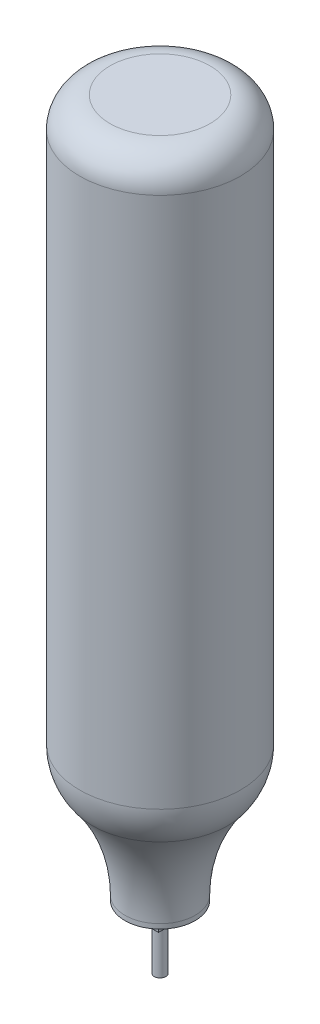
ISO-10303-21;
HEADER;
FILE_DESCRIPTION(('STEP AP214'),'2;1');
FILE_NAME('part.step','',(''),(''),'','','');
FILE_SCHEMA(('AUTOMOTIVE_DESIGN { 1 0 10303 214 1 1 1 1 }'));
ENDSEC;
DATA;
#1=APPLICATION_CONTEXT('core data for automotive mechanical design processes');
#2=APPLICATION_PROTOCOL_DEFINITION('international standard','automotive_design',2000,#1);
#3=PRODUCT_CONTEXT('',#1,'mechanical');
#4=PRODUCT('Part','Part','',(#3));
#5=PRODUCT_RELATED_PRODUCT_CATEGORY('part','',(#4));
#6=PRODUCT_DEFINITION_FORMATION('','',#4);
#7=PRODUCT_DEFINITION_CONTEXT('part definition',#1,'design');
#8=PRODUCT_DEFINITION('design','',#6,#7);
#9=PRODUCT_DEFINITION_SHAPE('','',#8);
#10=(LENGTH_UNIT() NAMED_UNIT(*) SI_UNIT(.MILLI.,.METRE.));
#11=(NAMED_UNIT(*) PLANE_ANGLE_UNIT() SI_UNIT($,.RADIAN.));
#12=(NAMED_UNIT(*) SI_UNIT($,.STERADIAN.) SOLID_ANGLE_UNIT());
#13=UNCERTAINTY_MEASURE_WITH_UNIT(LENGTH_MEASURE(1.E-05),#10,'distance_accuracy_value','');
#14=(GEOMETRIC_REPRESENTATION_CONTEXT(3) GLOBAL_UNCERTAINTY_ASSIGNED_CONTEXT((#13)) GLOBAL_UNIT_ASSIGNED_CONTEXT((#10,
#11,#12)) REPRESENTATION_CONTEXT('',''));
#15=CARTESIAN_POINT('',(0.,0.,0.));
#16=DIRECTION('',(0.,0.,1.));
#17=DIRECTION('',(1.,0.,0.));
#18=AXIS2_PLACEMENT_3D('',#15,#16,#17);
#19=CARTESIAN_POINT('',(0.,0.,0.));
#20=DIRECTION('',(0.,1.,0.));
#21=DIRECTION('',(0.,0.,1.));
#22=AXIS2_PLACEMENT_3D('',#19,#20,#21);
#23=PLANE('',#22);
#24=CARTESIAN_POINT('',(0.,0.,0.));
#25=DIRECTION('',(0.,-1.,0.));
#26=DIRECTION('',(0.,0.,-1.));
#27=AXIS2_PLACEMENT_3D('',#24,#25,#26);
#28=CIRCLE('',#27,11.5644162933336);
#29=CARTESIAN_POINT('',(0.,0.,-11.5644162933336));
#30=VERTEX_POINT('',#29);
#31=EDGE_CURVE('E109',#30,#30,#28,.T.);
#32=ORIENTED_EDGE('',*,*,#31,.T.);
#33=EDGE_LOOP('',(#32));
#34=FACE_BOUND('',#33,.T.);
#35=DIRECTION('',(0.,0.,-1.));
#36=VECTOR('',#35,1.);
#37=CARTESIAN_POINT('',(-3.47376504276298,0.,-3.99491974947905));
#38=LINE('',#37,#36);
#39=CARTESIAN_POINT('',(-3.47376504276298,0.,3.99491974947905));
#40=VERTEX_POINT('',#39);
#41=CARTESIAN_POINT('',(-3.47376504276298,0.,-3.99491974947905));
#42=VERTEX_POINT('',#41);
#43=EDGE_CURVE('E60',#40,#42,#38,.T.);
#44=ORIENTED_EDGE('',*,*,#43,.F.);
#45=DIRECTION('',(-1.,0.,0.));
#46=VECTOR('',#45,1.);
#47=CARTESIAN_POINT('',(3.47376504276298,0.,3.99491974947905));
#48=LINE('',#47,#46);
#49=CARTESIAN_POINT('',(3.47376504276298,0.,3.99491974947905));
#50=VERTEX_POINT('',#49);
#51=EDGE_CURVE('E64',#50,#40,#48,.T.);
#52=ORIENTED_EDGE('',*,*,#51,.F.);
#53=DIRECTION('',(0.,0.,1.));
#54=VECTOR('',#53,1.);
#55=CARTESIAN_POINT('',(3.47376504276298,0.,-3.99491974947905));
#56=LINE('',#55,#54);
#57=CARTESIAN_POINT('',(3.47376504276298,0.,-3.99491974947905));
#58=VERTEX_POINT('',#57);
#59=EDGE_CURVE('E219',#58,#50,#56,.T.);
#60=ORIENTED_EDGE('',*,*,#59,.F.);
#61=DIRECTION('',(1.,0.,0.));
#62=VECTOR('',#61,1.);
#63=CARTESIAN_POINT('',(3.47376504276298,0.,-3.99491974947905));
#64=LINE('',#63,#62);
#65=EDGE_CURVE('E209',#42,#58,#64,.T.);
#66=ORIENTED_EDGE('',*,*,#65,.F.);
#67=EDGE_LOOP('',(#44,#52,#60,#66));
#68=FACE_BOUND('',#67,.T.);
#69=ADVANCED_FACE('F43',(#34,#68),#23,.F.);
#70=CARTESIAN_POINT('',(0.,230.,0.));
#71=DIRECTION('',(0.,-1.,0.));
#72=DIRECTION('',(0.,0.,-1.));
#73=AXIS2_PLACEMENT_3D('',#70,#71,#72);
#74=CYLINDRICAL_SURFACE('',#73,26.5);
#75=CARTESIAN_POINT('',(0.,220.,0.));
#76=DIRECTION('',(0.,1.,0.));
#77=DIRECTION('',(0.,0.,1.));
#78=AXIS2_PLACEMENT_3D('',#75,#76,#77);
#79=CIRCLE('',#78,26.5);
#80=CARTESIAN_POINT('',(0.,220.,26.5));
#81=VERTEX_POINT('',#80);
#82=EDGE_CURVE('E47',#81,#81,#79,.F.);
#83=ORIENTED_EDGE('',*,*,#82,.T.);
#84=EDGE_LOOP('',(#83));
#85=FACE_BOUND('',#84,.T.);
#86=CARTESIAN_POINT('',(0.,44.7481701359022,0.));
#87=DIRECTION('',(0.,-1.,0.));
#88=DIRECTION('',(0.,0.,-1.));
#89=AXIS2_PLACEMENT_3D('',#86,#87,#88);
#90=CIRCLE('',#89,26.5);
#91=CARTESIAN_POINT('',(0.,44.7481701359022,-26.5));
#92=VERTEX_POINT('',#91);
#93=EDGE_CURVE('E114',#92,#92,#90,.F.);
#94=ORIENTED_EDGE('',*,*,#93,.T.);
#95=EDGE_LOOP('',(#94));
#96=FACE_BOUND('',#95,.T.);
#97=ADVANCED_FACE('F139',(#85,#96),#74,.T.);
#98=CARTESIAN_POINT('',(0.,230.,0.));
#99=DIRECTION('',(0.,1.,0.));
#100=DIRECTION('',(0.,0.,1.));
#101=AXIS2_PLACEMENT_3D('',#98,#99,#100);
#102=PLANE('',#101);
#103=CARTESIAN_POINT('',(0.,230.,0.));
#104=DIRECTION('',(0.,1.,0.));
#105=DIRECTION('',(0.,0.,1.));
#106=AXIS2_PLACEMENT_3D('',#103,#104,#105);
#107=CIRCLE('',#106,16.5);
#108=CARTESIAN_POINT('',(0.,230.,16.5));
#109=VERTEX_POINT('',#108);
#110=EDGE_CURVE('E130',#109,#109,#107,.T.);
#111=ORIENTED_EDGE('',*,*,#110,.T.);
#112=EDGE_LOOP('',(#111));
#113=FACE_BOUND('',#112,.T.);
#114=ADVANCED_FACE('F158',(#113),#102,.T.);
#115=CARTESIAN_POINT('',(0.,25.4,0.));
#116=DIRECTION('',(0.,-1.,0.));
#117=DIRECTION('',(0.,0.,-1.));
#118=AXIS2_PLACEMENT_3D('',#115,#116,#117);
#119=CYLINDRICAL_SURFACE('',#118,11.5644162933336);
#120=CARTESIAN_POINT('',(0.,1.52884508015357,0.));
#121=DIRECTION('',(0.,-1.,0.));
#122=DIRECTION('',(0.,0.,-1.));
#123=AXIS2_PLACEMENT_3D('',#120,#121,#122);
#124=CIRCLE('',#123,11.5644162933336);
#125=CARTESIAN_POINT('',(0.,1.52884508015357,-11.5644162933336));
#126=VERTEX_POINT('',#125);
#127=EDGE_CURVE('E123',#126,#126,#124,.T.);
#128=ORIENTED_EDGE('',*,*,#127,.T.);
#129=EDGE_LOOP('',(#128));
#130=FACE_BOUND('',#129,.T.);
#131=ORIENTED_EDGE('',*,*,#31,.F.);
#132=EDGE_LOOP('',(#131));
#133=FACE_BOUND('',#132,.T.);
#134=ADVANCED_FACE('F164',(#130,#133),#119,.T.);
#135=CARTESIAN_POINT('',(0.,44.7481701359022,0.));
#136=DIRECTION('',(0.,-1.,0.));
#137=DIRECTION('',(0.,0.,-1.));
#138=AXIS2_PLACEMENT_3D('',#135,#136,#137);
#139=DEGENERATE_TOROIDAL_SURFACE('',#138,6.5,20.,.T.);
#140=CARTESIAN_POINT('',(0.,32.3997915485454,0.));
#141=DIRECTION('',(0.,1.,0.));
#142=DIRECTION('',(0.,0.,1.));
#143=AXIS2_PLACEMENT_3D('',#140,#141,#142);
#144=CIRCLE('',#143,22.2326903695239);
#145=CARTESIAN_POINT('',(0.,32.3997915485454,22.2326903695239));
#146=VERTEX_POINT('',#145);
#147=EDGE_CURVE('E127',#146,#146,#144,.T.);
#148=ORIENTED_EDGE('',*,*,#147,.T.);
#149=EDGE_LOOP('',(#148));
#150=FACE_BOUND('',#149,.T.);
#151=ORIENTED_EDGE('',*,*,#93,.F.);
#152=EDGE_LOOP('',(#151));
#153=FACE_BOUND('',#152,.T.);
#154=ADVANCED_FACE('F150',(#150,#153),#139,.T.);
#155=CARTESIAN_POINT('',(0.,1.52884508015357,0.));
#156=DIRECTION('',(0.,-1.,0.));
#157=DIRECTION('',(0.,0.,-1.));
#158=AXIS2_PLACEMENT_3D('',#155,#156,#157);
#159=TOROIDAL_SURFACE('',#158,61.5644162933336,50.);
#160=ORIENTED_EDGE('',*,*,#147,.F.);
#161=EDGE_LOOP('',(#160));
#162=FACE_BOUND('',#161,.T.);
#163=ORIENTED_EDGE('',*,*,#127,.F.);
#164=EDGE_LOOP('',(#163));
#165=FACE_BOUND('',#164,.T.);
#166=ADVANCED_FACE('F144',(#162,#165),#159,.F.);
#167=CARTESIAN_POINT('',(0.,220.,0.));
#168=DIRECTION('',(0.,1.,0.));
#169=DIRECTION('',(0.,0.,1.));
#170=AXIS2_PLACEMENT_3D('',#167,#168,#169);
#171=TOROIDAL_SURFACE('',#170,16.5,10.);
#172=ORIENTED_EDGE('',*,*,#82,.F.);
#173=EDGE_LOOP('',(#172));
#174=FACE_BOUND('',#173,.T.);
#175=ORIENTED_EDGE('',*,*,#110,.F.);
#176=EDGE_LOOP('',(#175));
#177=FACE_BOUND('',#176,.T.);
#178=ADVANCED_FACE('F45',(#174,#177),#171,.T.);
#179=CARTESIAN_POINT('',(-3.47376504276298,-5.4,-3.99491974947905));
#180=DIRECTION('',(1.,0.,0.));
#181=DIRECTION('',(0.,0.,-1.));
#182=AXIS2_PLACEMENT_3D('',#179,#180,#181);
#183=PLANE('',#182);
#184=ORIENTED_EDGE('',*,*,#43,.T.);
#185=DIRECTION('',(0.,1.,0.));
#186=VECTOR('',#185,1.);
#187=CARTESIAN_POINT('',(-3.47376504276298,-5.4,-3.99491974947905));
#188=LINE('',#187,#186);
#189=CARTESIAN_POINT('',(-3.47376504276298,-5.4,-3.99491974947905));
#190=VERTEX_POINT('',#189);
#191=EDGE_CURVE('E89',#190,#42,#188,.T.);
#192=ORIENTED_EDGE('',*,*,#191,.F.);
#193=DIRECTION('',(0.,0.,-1.));
#194=VECTOR('',#193,1.);
#195=CARTESIAN_POINT('',(-3.47376504276298,-5.4,-3.99491974947905));
#196=LINE('',#195,#194);
#197=CARTESIAN_POINT('',(-3.47376504276298,-5.4,3.99491974947905));
#198=VERTEX_POINT('',#197);
#199=EDGE_CURVE('E96',#198,#190,#196,.T.);
#200=ORIENTED_EDGE('',*,*,#199,.F.);
#201=DIRECTION('',(0.,1.,0.));
#202=VECTOR('',#201,1.);
#203=CARTESIAN_POINT('',(-3.47376504276298,-5.4,3.99491974947905));
#204=LINE('',#203,#202);
#205=EDGE_CURVE('E215',#198,#40,#204,.T.);
#206=ORIENTED_EDGE('',*,*,#205,.T.);
#207=EDGE_LOOP('',(#184,#192,#200,#206));
#208=FACE_BOUND('',#207,.T.);
#209=ADVANCED_FACE('F107',(#208),#183,.F.);
#210=CARTESIAN_POINT('',(3.47376504276298,-5.4,-3.99491974947905));
#211=DIRECTION('',(0.,0.,1.));
#212=DIRECTION('',(1.,0.,0.));
#213=AXIS2_PLACEMENT_3D('',#210,#211,#212);
#214=PLANE('',#213);
#215=ORIENTED_EDGE('',*,*,#65,.T.);
#216=DIRECTION('',(0.,1.,0.));
#217=VECTOR('',#216,1.);
#218=CARTESIAN_POINT('',(3.47376504276298,-5.4,-3.99491974947905));
#219=LINE('',#218,#217);
#220=CARTESIAN_POINT('',(3.47376504276298,-5.4,-3.99491974947905));
#221=VERTEX_POINT('',#220);
#222=EDGE_CURVE('E91',#221,#58,#219,.T.);
#223=ORIENTED_EDGE('',*,*,#222,.F.);
#224=DIRECTION('',(1.,0.,0.));
#225=VECTOR('',#224,1.);
#226=CARTESIAN_POINT('',(3.47376504276298,-5.4,-3.99491974947905));
#227=LINE('',#226,#225);
#228=EDGE_CURVE('E84',#190,#221,#227,.T.);
#229=ORIENTED_EDGE('',*,*,#228,.F.);
#230=ORIENTED_EDGE('',*,*,#191,.T.);
#231=EDGE_LOOP('',(#215,#223,#229,#230));
#232=FACE_BOUND('',#231,.T.);
#233=ADVANCED_FACE('F87',(#232),#214,.F.);
#234=CARTESIAN_POINT('',(3.47376504276298,-5.4,-3.99491974947905));
#235=DIRECTION('',(-1.,0.,0.));
#236=DIRECTION('',(0.,0.,1.));
#237=AXIS2_PLACEMENT_3D('',#234,#235,#236);
#238=PLANE('',#237);
#239=ORIENTED_EDGE('',*,*,#59,.T.);
#240=DIRECTION('',(0.,1.,0.));
#241=VECTOR('',#240,1.);
#242=CARTESIAN_POINT('',(3.47376504276298,-5.4,3.99491974947905));
#243=LINE('',#242,#241);
#244=CARTESIAN_POINT('',(3.47376504276298,-5.4,3.99491974947905));
#245=VERTEX_POINT('',#244);
#246=EDGE_CURVE('E116',#245,#50,#243,.T.);
#247=ORIENTED_EDGE('',*,*,#246,.F.);
#248=DIRECTION('',(0.,0.,1.));
#249=VECTOR('',#248,1.);
#250=CARTESIAN_POINT('',(3.47376504276298,-5.4,-3.99491974947905));
#251=LINE('',#250,#249);
#252=EDGE_CURVE('E95',#221,#245,#251,.T.);
#253=ORIENTED_EDGE('',*,*,#252,.F.);
#254=ORIENTED_EDGE('',*,*,#222,.T.);
#255=EDGE_LOOP('',(#239,#247,#253,#254));
#256=FACE_BOUND('',#255,.T.);
#257=ADVANCED_FACE('F183',(#256),#238,.F.);
#258=CARTESIAN_POINT('',(3.47376504276298,-5.4,3.99491974947905));
#259=DIRECTION('',(0.,0.,-1.));
#260=DIRECTION('',(-1.,0.,0.));
#261=AXIS2_PLACEMENT_3D('',#258,#259,#260);
#262=PLANE('',#261);
#263=ORIENTED_EDGE('',*,*,#51,.T.);
#264=ORIENTED_EDGE('',*,*,#205,.F.);
#265=DIRECTION('',(-1.,0.,0.));
#266=VECTOR('',#265,1.);
#267=CARTESIAN_POINT('',(3.47376504276298,-5.4,3.99491974947905));
#268=LINE('',#267,#266);
#269=EDGE_CURVE('E101',#245,#198,#268,.T.);
#270=ORIENTED_EDGE('',*,*,#269,.F.);
#271=ORIENTED_EDGE('',*,*,#246,.T.);
#272=EDGE_LOOP('',(#263,#264,#270,#271));
#273=FACE_BOUND('',#272,.T.);
#274=ADVANCED_FACE('F186',(#273),#262,.F.);
#275=CARTESIAN_POINT('',(0.,-5.4,0.));
#276=DIRECTION('',(0.,-1.,0.));
#277=DIRECTION('',(0.,0.,-1.));
#278=AXIS2_PLACEMENT_3D('',#275,#276,#277);
#279=PLANE('',#278);
#280=CARTESIAN_POINT('',(0.,-5.4,0.));
#281=DIRECTION('',(0.,-1.,0.));
#282=DIRECTION('',(0.,0.,-1.));
#283=AXIS2_PLACEMENT_3D('',#280,#281,#282);
#284=CIRCLE('',#283,1.89496056229945);
#285=CARTESIAN_POINT('',(0.,-5.4,-1.89496056229945));
#286=VERTEX_POINT('',#285);
#287=EDGE_CURVE('E11',#286,#286,#284,.T.);
#288=ORIENTED_EDGE('',*,*,#287,.F.);
#289=EDGE_LOOP('',(#288));
#290=FACE_BOUND('',#289,.T.);
#291=ORIENTED_EDGE('',*,*,#199,.T.);
#292=ORIENTED_EDGE('',*,*,#228,.T.);
#293=ORIENTED_EDGE('',*,*,#252,.T.);
#294=ORIENTED_EDGE('',*,*,#269,.T.);
#295=EDGE_LOOP('',(#291,#292,#293,#294));
#296=FACE_BOUND('',#295,.T.);
#297=ADVANCED_FACE('F99',(#290,#296),#279,.T.);
#298=CARTESIAN_POINT('',(0.,-20.8,0.));
#299=DIRECTION('',(0.,1.,0.));
#300=DIRECTION('',(0.,0.,1.));
#301=AXIS2_PLACEMENT_3D('',#298,#299,#300);
#302=CYLINDRICAL_SURFACE('',#301,1.89496056229945);
#303=CARTESIAN_POINT('',(0.,-20.8,0.));
#304=DIRECTION('',(0.,-1.,0.));
#305=DIRECTION('',(0.,0.,-1.));
#306=AXIS2_PLACEMENT_3D('',#303,#304,#305);
#307=CIRCLE('',#306,1.89496056229945);
#308=CARTESIAN_POINT('',(0.,-20.8,-1.89496056229945));
#309=VERTEX_POINT('',#308);
#310=EDGE_CURVE('E205',#309,#309,#307,.T.);
#311=ORIENTED_EDGE('',*,*,#310,.F.);
#312=EDGE_LOOP('',(#311));
#313=FACE_BOUND('',#312,.T.);
#314=ORIENTED_EDGE('',*,*,#287,.T.);
#315=EDGE_LOOP('',(#314));
#316=FACE_BOUND('',#315,.T.);
#317=ADVANCED_FACE('F193',(#313,#316),#302,.T.);
#318=CARTESIAN_POINT('',(0.,-20.8,0.));
#319=DIRECTION('',(0.,-1.,0.));
#320=DIRECTION('',(0.,0.,-1.));
#321=AXIS2_PLACEMENT_3D('',#318,#319,#320);
#322=PLANE('',#321);
#323=ORIENTED_EDGE('',*,*,#310,.T.);
#324=EDGE_LOOP('',(#323));
#325=FACE_BOUND('',#324,.T.);
#326=ADVANCED_FACE('F197',(#325),#322,.T.);
#327=CLOSED_SHELL('',(#69,#97,#114,#134,#154,#166,#178,#209,#233,#257,#274,#297,#317,#326));
#328=MANIFOLD_SOLID_BREP('B2',#327);
#329=ADVANCED_BREP_SHAPE_REPRESENTATION('',(#18,#328),#14);
#330=SHAPE_DEFINITION_REPRESENTATION(#9,#329);
ENDSEC;
END-ISO-10303-21;
